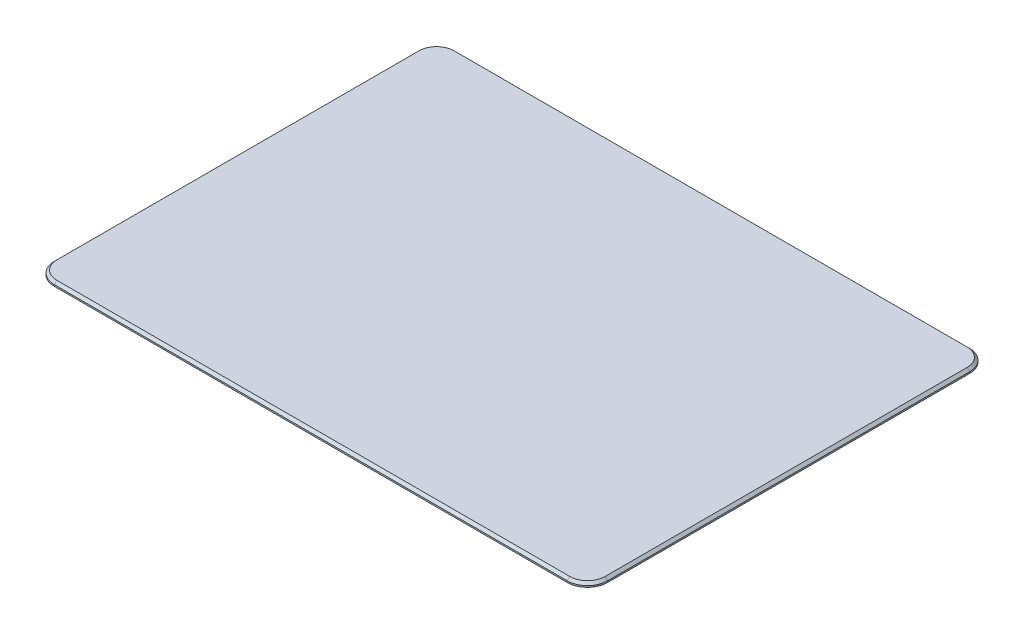
ISO-10303-21;
HEADER;
FILE_DESCRIPTION(('STEP AP214'),'2;1');
FILE_NAME('part.step','',(''),(''),'','','');
FILE_SCHEMA(('AUTOMOTIVE_DESIGN { 1 0 10303 214 1 1 1 1 }'));
ENDSEC;
DATA;
#1=APPLICATION_CONTEXT('core data for automotive mechanical design processes');
#2=APPLICATION_PROTOCOL_DEFINITION('international standard','automotive_design',2000,#1);
#3=PRODUCT_CONTEXT('',#1,'mechanical');
#4=PRODUCT('Part','Part','',(#3));
#5=PRODUCT_RELATED_PRODUCT_CATEGORY('part','',(#4));
#6=PRODUCT_DEFINITION_FORMATION('','',#4);
#7=PRODUCT_DEFINITION_CONTEXT('part definition',#1,'design');
#8=PRODUCT_DEFINITION('design','',#6,#7);
#9=PRODUCT_DEFINITION_SHAPE('','',#8);
#10=(LENGTH_UNIT() NAMED_UNIT(*) SI_UNIT(.MILLI.,.METRE.));
#11=(NAMED_UNIT(*) PLANE_ANGLE_UNIT() SI_UNIT($,.RADIAN.));
#12=(NAMED_UNIT(*) SI_UNIT($,.STERADIAN.) SOLID_ANGLE_UNIT());
#13=UNCERTAINTY_MEASURE_WITH_UNIT(LENGTH_MEASURE(1.E-05),#10,'distance_accuracy_value','');
#14=(GEOMETRIC_REPRESENTATION_CONTEXT(3) GLOBAL_UNCERTAINTY_ASSIGNED_CONTEXT((#13)) GLOBAL_UNIT_ASSIGNED_CONTEXT((#10,
#11,#12)) REPRESENTATION_CONTEXT('',''));
#15=CARTESIAN_POINT('',(0.,0.,0.));
#16=DIRECTION('',(0.,0.,1.));
#17=DIRECTION('',(1.,0.,0.));
#18=AXIS2_PLACEMENT_3D('',#15,#16,#17);
#19=CARTESIAN_POINT('',(275.,4.,200.));
#20=DIRECTION('',(-1.,0.,0.));
#21=DIRECTION('',(0.,0.,1.));
#22=AXIS2_PLACEMENT_3D('',#19,#20,#21);
#23=PLANE('',#22);
#24=DIRECTION('',(0.,-1.,0.));
#25=VECTOR('',#24,1.);
#26=CARTESIAN_POINT('',(275.,4.,-180.));
#27=LINE('',#26,#25);
#28=CARTESIAN_POINT('',(275.,0.,-180.));
#29=VERTEX_POINT('',#28);
#30=CARTESIAN_POINT('',(275.,1.49999999999989,-180.));
#31=VERTEX_POINT('',#30);
#32=EDGE_CURVE('E169',#29,#31,#27,.F.);
#33=ORIENTED_EDGE('',*,*,#32,.T.);
#34=DIRECTION('',(0.,0.,1.));
#35=VECTOR('',#34,1.);
#36=CARTESIAN_POINT('',(275.,1.49999999999989,200.));
#37=LINE('',#36,#35);
#38=CARTESIAN_POINT('',(275.,1.49999999999989,180.));
#39=VERTEX_POINT('',#38);
#40=EDGE_CURVE('E192',#31,#39,#37,.T.);
#41=ORIENTED_EDGE('',*,*,#40,.T.);
#42=DIRECTION('',(0.,-1.,0.));
#43=VECTOR('',#42,1.);
#44=CARTESIAN_POINT('',(275.,4.,180.));
#45=LINE('',#44,#43);
#46=CARTESIAN_POINT('',(275.,0.,180.));
#47=VERTEX_POINT('',#46);
#48=EDGE_CURVE('E167',#39,#47,#45,.T.);
#49=ORIENTED_EDGE('',*,*,#48,.T.);
#50=DIRECTION('',(0.,0.,-1.));
#51=VECTOR('',#50,1.);
#52=CARTESIAN_POINT('',(275.,0.,200.));
#53=LINE('',#52,#51);
#54=EDGE_CURVE('E151',#47,#29,#53,.T.);
#55=ORIENTED_EDGE('',*,*,#54,.T.);
#56=EDGE_LOOP('',(#33,#41,#49,#55));
#57=FACE_BOUND('',#56,.T.);
#58=ADVANCED_FACE('F35',(#57),#23,.F.);
#59=CARTESIAN_POINT('',(-275.,4.,-200.));
#60=DIRECTION('',(0.,0.,1.));
#61=DIRECTION('',(1.,0.,0.));
#62=AXIS2_PLACEMENT_3D('',#59,#60,#61);
#63=PLANE('',#62);
#64=DIRECTION('',(0.,-1.,0.));
#65=VECTOR('',#64,1.);
#66=CARTESIAN_POINT('',(-255.,4.,-200.));
#67=LINE('',#66,#65);
#68=CARTESIAN_POINT('',(-255.,0.,-200.));
#69=VERTEX_POINT('',#68);
#70=CARTESIAN_POINT('',(-255.,1.49999999999989,-200.));
#71=VERTEX_POINT('',#70);
#72=EDGE_CURVE('E136',#69,#71,#67,.F.);
#73=ORIENTED_EDGE('',*,*,#72,.T.);
#74=DIRECTION('',(1.,0.,0.));
#75=VECTOR('',#74,1.);
#76=CARTESIAN_POINT('',(-275.,1.49999999999989,-200.));
#77=LINE('',#76,#75);
#78=CARTESIAN_POINT('',(255.,1.49999999999989,-200.));
#79=VERTEX_POINT('',#78);
#80=EDGE_CURVE('E11',#71,#79,#77,.T.);
#81=ORIENTED_EDGE('',*,*,#80,.T.);
#82=DIRECTION('',(0.,-1.,0.));
#83=VECTOR('',#82,1.);
#84=CARTESIAN_POINT('',(255.,4.,-200.));
#85=LINE('',#84,#83);
#86=CARTESIAN_POINT('',(255.,0.,-200.));
#87=VERTEX_POINT('',#86);
#88=EDGE_CURVE('E140',#79,#87,#85,.T.);
#89=ORIENTED_EDGE('',*,*,#88,.T.);
#90=DIRECTION('',(-1.,0.,0.));
#91=VECTOR('',#90,1.);
#92=CARTESIAN_POINT('',(-275.,0.,-200.));
#93=LINE('',#92,#91);
#94=EDGE_CURVE('E147',#87,#69,#93,.T.);
#95=ORIENTED_EDGE('',*,*,#94,.T.);
#96=EDGE_LOOP('',(#73,#81,#89,#95));
#97=FACE_BOUND('',#96,.T.);
#98=ADVANCED_FACE('F285',(#97),#63,.F.);
#99=CARTESIAN_POINT('',(-275.,4.,200.));
#100=DIRECTION('',(1.,0.,0.));
#101=DIRECTION('',(0.,0.,-1.));
#102=AXIS2_PLACEMENT_3D('',#99,#100,#101);
#103=PLANE('',#102);
#104=DIRECTION('',(0.,-1.,0.));
#105=VECTOR('',#104,1.);
#106=CARTESIAN_POINT('',(-275.,4.,180.));
#107=LINE('',#106,#105);
#108=CARTESIAN_POINT('',(-275.,0.,180.));
#109=VERTEX_POINT('',#108);
#110=CARTESIAN_POINT('',(-275.,1.49999999999989,180.));
#111=VERTEX_POINT('',#110);
#112=EDGE_CURVE('E132',#109,#111,#107,.F.);
#113=ORIENTED_EDGE('',*,*,#112,.T.);
#114=DIRECTION('',(0.,0.,-1.));
#115=VECTOR('',#114,1.);
#116=CARTESIAN_POINT('',(-275.,1.49999999999989,200.));
#117=LINE('',#116,#115);
#118=CARTESIAN_POINT('',(-275.,1.49999999999989,-180.));
#119=VERTEX_POINT('',#118);
#120=EDGE_CURVE('E59',#111,#119,#117,.T.);
#121=ORIENTED_EDGE('',*,*,#120,.T.);
#122=DIRECTION('',(0.,-1.,0.));
#123=VECTOR('',#122,1.);
#124=CARTESIAN_POINT('',(-275.,4.,-180.));
#125=LINE('',#124,#123);
#126=CARTESIAN_POINT('',(-275.,0.,-180.));
#127=VERTEX_POINT('',#126);
#128=EDGE_CURVE('E124',#119,#127,#125,.T.);
#129=ORIENTED_EDGE('',*,*,#128,.T.);
#130=DIRECTION('',(0.,0.,1.));
#131=VECTOR('',#130,1.);
#132=CARTESIAN_POINT('',(-275.,0.,200.));
#133=LINE('',#132,#131);
#134=EDGE_CURVE('E128',#127,#109,#133,.T.);
#135=ORIENTED_EDGE('',*,*,#134,.T.);
#136=EDGE_LOOP('',(#113,#121,#129,#135));
#137=FACE_BOUND('',#136,.T.);
#138=ADVANCED_FACE('F126',(#137),#103,.F.);
#139=CARTESIAN_POINT('',(-275.,4.,200.));
#140=DIRECTION('',(0.,0.,-1.));
#141=DIRECTION('',(-1.,0.,0.));
#142=AXIS2_PLACEMENT_3D('',#139,#140,#141);
#143=PLANE('',#142);
#144=DIRECTION('',(0.,-1.,0.));
#145=VECTOR('',#144,1.);
#146=CARTESIAN_POINT('',(255.,4.,200.));
#147=LINE('',#146,#145);
#148=CARTESIAN_POINT('',(255.,0.,200.));
#149=VERTEX_POINT('',#148);
#150=CARTESIAN_POINT('',(255.,1.49999999999989,200.));
#151=VERTEX_POINT('',#150);
#152=EDGE_CURVE('E162',#149,#151,#147,.F.);
#153=ORIENTED_EDGE('',*,*,#152,.T.);
#154=DIRECTION('',(-1.,0.,0.));
#155=VECTOR('',#154,1.);
#156=CARTESIAN_POINT('',(-275.,1.49999999999989,200.));
#157=LINE('',#156,#155);
#158=CARTESIAN_POINT('',(-255.,1.49999999999989,200.));
#159=VERTEX_POINT('',#158);
#160=EDGE_CURVE('E196',#151,#159,#157,.T.);
#161=ORIENTED_EDGE('',*,*,#160,.T.);
#162=DIRECTION('',(0.,-1.,0.));
#163=VECTOR('',#162,1.);
#164=CARTESIAN_POINT('',(-255.,4.,200.));
#165=LINE('',#164,#163);
#166=CARTESIAN_POINT('',(-255.,0.,200.));
#167=VERTEX_POINT('',#166);
#168=EDGE_CURVE('E165',#159,#167,#165,.T.);
#169=ORIENTED_EDGE('',*,*,#168,.T.);
#170=DIRECTION('',(1.,0.,0.));
#171=VECTOR('',#170,1.);
#172=CARTESIAN_POINT('',(-275.,0.,200.));
#173=LINE('',#172,#171);
#174=EDGE_CURVE('E146',#167,#149,#173,.T.);
#175=ORIENTED_EDGE('',*,*,#174,.T.);
#176=EDGE_LOOP('',(#153,#161,#169,#175));
#177=FACE_BOUND('',#176,.T.);
#178=ADVANCED_FACE('F267',(#177),#143,.F.);
#179=CARTESIAN_POINT('',(0.,4.,0.));
#180=DIRECTION('',(0.,-1.,0.));
#181=DIRECTION('',(0.,0.,-1.));
#182=AXIS2_PLACEMENT_3D('',#179,#180,#181);
#183=PLANE('',#182);
#184=DIRECTION('',(0.,0.,-1.));
#185=VECTOR('',#184,1.);
#186=CARTESIAN_POINT('',(272.5,4.,0.));
#187=LINE('',#186,#185);
#188=CARTESIAN_POINT('',(272.5,4.,180.));
#189=VERTEX_POINT('',#188);
#190=CARTESIAN_POINT('',(272.5,4.,-180.));
#191=VERTEX_POINT('',#190);
#192=EDGE_CURVE('E184',#189,#191,#187,.T.);
#193=ORIENTED_EDGE('',*,*,#192,.T.);
#194=CARTESIAN_POINT('',(255.,4.,-180.));
#195=DIRECTION('',(0.,-1.,0.));
#196=DIRECTION('',(0.,0.,-1.));
#197=AXIS2_PLACEMENT_3D('',#194,#195,#196);
#198=CIRCLE('',#197,17.4999999999999);
#199=CARTESIAN_POINT('',(255.,4.,-197.5));
#200=VERTEX_POINT('',#199);
#201=EDGE_CURVE('E186',#191,#200,#198,.F.);
#202=ORIENTED_EDGE('',*,*,#201,.T.);
#203=DIRECTION('',(-1.,0.,0.));
#204=VECTOR('',#203,1.);
#205=CARTESIAN_POINT('',(0.,4.,-197.5));
#206=LINE('',#205,#204);
#207=CARTESIAN_POINT('',(-255.,4.,-197.5));
#208=VERTEX_POINT('',#207);
#209=EDGE_CURVE('E172',#200,#208,#206,.T.);
#210=ORIENTED_EDGE('',*,*,#209,.T.);
#211=CARTESIAN_POINT('',(-255.,4.,-180.));
#212=DIRECTION('',(0.,-1.,0.));
#213=DIRECTION('',(0.,0.,-1.));
#214=AXIS2_PLACEMENT_3D('',#211,#212,#213);
#215=CIRCLE('',#214,17.4999999999999);
#216=CARTESIAN_POINT('',(-272.5,4.,-180.));
#217=VERTEX_POINT('',#216);
#218=EDGE_CURVE('E174',#208,#217,#215,.F.);
#219=ORIENTED_EDGE('',*,*,#218,.T.);
#220=DIRECTION('',(0.,0.,1.));
#221=VECTOR('',#220,1.);
#222=CARTESIAN_POINT('',(-272.5,4.,0.));
#223=LINE('',#222,#221);
#224=CARTESIAN_POINT('',(-272.5,4.,180.));
#225=VERTEX_POINT('',#224);
#226=EDGE_CURVE('E176',#217,#225,#223,.T.);
#227=ORIENTED_EDGE('',*,*,#226,.T.);
#228=CARTESIAN_POINT('',(-255.,4.,180.));
#229=DIRECTION('',(0.,-1.,0.));
#230=DIRECTION('',(0.,0.,-1.));
#231=AXIS2_PLACEMENT_3D('',#228,#229,#230);
#232=CIRCLE('',#231,17.4999999999999);
#233=CARTESIAN_POINT('',(-255.,4.,197.5));
#234=VERTEX_POINT('',#233);
#235=EDGE_CURVE('E178',#225,#234,#232,.F.);
#236=ORIENTED_EDGE('',*,*,#235,.T.);
#237=DIRECTION('',(1.,0.,0.));
#238=VECTOR('',#237,1.);
#239=CARTESIAN_POINT('',(0.,4.,197.5));
#240=LINE('',#239,#238);
#241=CARTESIAN_POINT('',(255.,4.,197.5));
#242=VERTEX_POINT('',#241);
#243=EDGE_CURVE('E180',#234,#242,#240,.T.);
#244=ORIENTED_EDGE('',*,*,#243,.T.);
#245=CARTESIAN_POINT('',(255.,4.,180.));
#246=DIRECTION('',(0.,-1.,0.));
#247=DIRECTION('',(0.,0.,-1.));
#248=AXIS2_PLACEMENT_3D('',#245,#246,#247);
#249=CIRCLE('',#248,17.4999999999999);
#250=EDGE_CURVE('E182',#242,#189,#249,.F.);
#251=ORIENTED_EDGE('',*,*,#250,.T.);
#252=EDGE_LOOP('',(#193,#202,#210,#219,#227,#236,#244,#251));
#253=FACE_BOUND('',#252,.T.);
#254=ADVANCED_FACE('F251',(#253),#183,.F.);
#255=CARTESIAN_POINT('',(0.,0.,0.));
#256=DIRECTION('',(0.,-1.,0.));
#257=DIRECTION('',(0.,0.,-1.));
#258=AXIS2_PLACEMENT_3D('',#255,#256,#257);
#259=PLANE('',#258);
#260=ORIENTED_EDGE('',*,*,#134,.F.);
#261=CARTESIAN_POINT('',(-255.,0.,-180.));
#262=DIRECTION('',(0.,-1.,0.));
#263=DIRECTION('',(0.,0.,-1.));
#264=AXIS2_PLACEMENT_3D('',#261,#262,#263);
#265=CIRCLE('',#264,20.);
#266=EDGE_CURVE('E134',#127,#69,#265,.T.);
#267=ORIENTED_EDGE('',*,*,#266,.T.);
#268=ORIENTED_EDGE('',*,*,#94,.F.);
#269=CARTESIAN_POINT('',(255.,0.,-180.));
#270=DIRECTION('',(0.,-1.,0.));
#271=DIRECTION('',(0.,0.,-1.));
#272=AXIS2_PLACEMENT_3D('',#269,#270,#271);
#273=CIRCLE('',#272,20.);
#274=EDGE_CURVE('E157',#87,#29,#273,.T.);
#275=ORIENTED_EDGE('',*,*,#274,.T.);
#276=ORIENTED_EDGE('',*,*,#54,.F.);
#277=CARTESIAN_POINT('',(255.,0.,180.));
#278=DIRECTION('',(0.,-1.,0.));
#279=DIRECTION('',(0.,0.,-1.));
#280=AXIS2_PLACEMENT_3D('',#277,#278,#279);
#281=CIRCLE('',#280,20.);
#282=EDGE_CURVE('E131',#47,#149,#281,.T.);
#283=ORIENTED_EDGE('',*,*,#282,.T.);
#284=ORIENTED_EDGE('',*,*,#174,.F.);
#285=CARTESIAN_POINT('',(-255.,0.,180.));
#286=DIRECTION('',(0.,-1.,0.));
#287=DIRECTION('',(0.,0.,-1.));
#288=AXIS2_PLACEMENT_3D('',#285,#286,#287);
#289=CIRCLE('',#288,20.);
#290=EDGE_CURVE('E141',#167,#109,#289,.T.);
#291=ORIENTED_EDGE('',*,*,#290,.T.);
#292=EDGE_LOOP('',(#260,#267,#268,#275,#276,#283,#284,#291));
#293=FACE_BOUND('',#292,.T.);
#294=ADVANCED_FACE('F143',(#293),#259,.T.);
#295=CARTESIAN_POINT('',(-255.,4.,-180.));
#296=DIRECTION('',(0.,-1.,0.));
#297=DIRECTION('',(0.,0.,-1.));
#298=AXIS2_PLACEMENT_3D('',#295,#296,#297);
#299=CYLINDRICAL_SURFACE('',#298,20.);
#300=ORIENTED_EDGE('',*,*,#128,.F.);
#301=CARTESIAN_POINT('',(-255.,1.49999999999989,-180.));
#302=DIRECTION('',(0.,-1.,0.));
#303=DIRECTION('',(0.,0.,-1.));
#304=AXIS2_PLACEMENT_3D('',#301,#302,#303);
#305=CIRCLE('',#304,20.);
#306=EDGE_CURVE('E44',#119,#71,#305,.T.);
#307=ORIENTED_EDGE('',*,*,#306,.T.);
#308=ORIENTED_EDGE('',*,*,#72,.F.);
#309=ORIENTED_EDGE('',*,*,#266,.F.);
#310=EDGE_LOOP('',(#300,#307,#308,#309));
#311=FACE_BOUND('',#310,.T.);
#312=ADVANCED_FACE('F135',(#311),#299,.T.);
#313=CARTESIAN_POINT('',(-255.,4.,180.));
#314=DIRECTION('',(0.,-1.,0.));
#315=DIRECTION('',(0.,0.,-1.));
#316=AXIS2_PLACEMENT_3D('',#313,#314,#315);
#317=CYLINDRICAL_SURFACE('',#316,20.);
#318=ORIENTED_EDGE('',*,*,#168,.F.);
#319=CARTESIAN_POINT('',(-255.,1.49999999999989,180.));
#320=DIRECTION('',(0.,-1.,0.));
#321=DIRECTION('',(0.,0.,-1.));
#322=AXIS2_PLACEMENT_3D('',#319,#320,#321);
#323=CIRCLE('',#322,20.);
#324=EDGE_CURVE('E198',#159,#111,#323,.T.);
#325=ORIENTED_EDGE('',*,*,#324,.T.);
#326=ORIENTED_EDGE('',*,*,#112,.F.);
#327=ORIENTED_EDGE('',*,*,#290,.F.);
#328=EDGE_LOOP('',(#318,#325,#326,#327));
#329=FACE_BOUND('',#328,.T.);
#330=ADVANCED_FACE('F270',(#329),#317,.T.);
#331=CARTESIAN_POINT('',(255.,4.,-180.));
#332=DIRECTION('',(0.,-1.,0.));
#333=DIRECTION('',(0.,0.,-1.));
#334=AXIS2_PLACEMENT_3D('',#331,#332,#333);
#335=CYLINDRICAL_SURFACE('',#334,20.);
#336=ORIENTED_EDGE('',*,*,#88,.F.);
#337=CARTESIAN_POINT('',(255.,1.49999999999989,-180.));
#338=DIRECTION('',(0.,-1.,0.));
#339=DIRECTION('',(0.,0.,-1.));
#340=AXIS2_PLACEMENT_3D('',#337,#338,#339);
#341=CIRCLE('',#340,20.);
#342=EDGE_CURVE('E189',#79,#31,#341,.T.);
#343=ORIENTED_EDGE('',*,*,#342,.T.);
#344=ORIENTED_EDGE('',*,*,#32,.F.);
#345=ORIENTED_EDGE('',*,*,#274,.F.);
#346=EDGE_LOOP('',(#336,#343,#344,#345));
#347=FACE_BOUND('',#346,.T.);
#348=ADVANCED_FACE('F236',(#347),#335,.T.);
#349=CARTESIAN_POINT('',(255.,4.,180.));
#350=DIRECTION('',(0.,-1.,0.));
#351=DIRECTION('',(0.,0.,-1.));
#352=AXIS2_PLACEMENT_3D('',#349,#350,#351);
#353=CYLINDRICAL_SURFACE('',#352,20.);
#354=ORIENTED_EDGE('',*,*,#48,.F.);
#355=CARTESIAN_POINT('',(255.,1.49999999999989,180.));
#356=DIRECTION('',(0.,-1.,0.));
#357=DIRECTION('',(0.,0.,-1.));
#358=AXIS2_PLACEMENT_3D('',#355,#356,#357);
#359=CIRCLE('',#358,20.);
#360=EDGE_CURVE('E194',#39,#151,#359,.T.);
#361=ORIENTED_EDGE('',*,*,#360,.T.);
#362=ORIENTED_EDGE('',*,*,#152,.F.);
#363=ORIENTED_EDGE('',*,*,#282,.F.);
#364=EDGE_LOOP('',(#354,#361,#362,#363));
#365=FACE_BOUND('',#364,.T.);
#366=ADVANCED_FACE('F259',(#365),#353,.T.);
#367=CARTESIAN_POINT('',(-255.,4.,180.));
#368=DIRECTION('',(0.,-1.,0.));
#369=DIRECTION('',(0.,0.,-1.));
#370=AXIS2_PLACEMENT_3D('',#367,#368,#369);
#371=CONICAL_SURFACE('',#370,17.4999999999999,0.78539816339745);
#372=DIRECTION('',(0.707106781186548,0.707106781186548,0.));
#373=VECTOR('',#372,1.);
#374=CARTESIAN_POINT('',(-275.,1.49999999999989,180.));
#375=LINE('',#374,#373);
#376=EDGE_CURVE('E217',#111,#225,#375,.T.);
#377=ORIENTED_EDGE('',*,*,#376,.F.);
#378=ORIENTED_EDGE('',*,*,#324,.F.);
#379=DIRECTION('',(0.,-0.707106781186548,0.707106781186548));
#380=VECTOR('',#379,1.);
#381=CARTESIAN_POINT('',(-255.,4.,197.5));
#382=LINE('',#381,#380);
#383=EDGE_CURVE('E39',#234,#159,#382,.T.);
#384=ORIENTED_EDGE('',*,*,#383,.F.);
#385=ORIENTED_EDGE('',*,*,#235,.F.);
#386=EDGE_LOOP('',(#377,#378,#384,#385));
#387=FACE_BOUND('',#386,.T.);
#388=ADVANCED_FACE('F37',(#387),#371,.T.);
#389=CARTESIAN_POINT('',(0.,4.,197.5));
#390=DIRECTION('',(0.,-0.707106781186548,-0.707106781186548));
#391=DIRECTION('',(1.,0.,0.));
#392=AXIS2_PLACEMENT_3D('',#389,#390,#391);
#393=PLANE('',#392);
#394=ORIENTED_EDGE('',*,*,#383,.T.);
#395=ORIENTED_EDGE('',*,*,#160,.F.);
#396=DIRECTION('',(0.,-0.707106781186548,0.707106781186548));
#397=VECTOR('',#396,1.);
#398=CARTESIAN_POINT('',(255.,4.,197.5));
#399=LINE('',#398,#397);
#400=EDGE_CURVE('E215',#242,#151,#399,.T.);
#401=ORIENTED_EDGE('',*,*,#400,.F.);
#402=ORIENTED_EDGE('',*,*,#243,.F.);
#403=EDGE_LOOP('',(#394,#395,#401,#402));
#404=FACE_BOUND('',#403,.T.);
#405=ADVANCED_FACE('F264',(#404),#393,.F.);
#406=CARTESIAN_POINT('',(-272.5,4.,0.));
#407=DIRECTION('',(0.707106781186548,-0.707106781186548,0.));
#408=DIRECTION('',(0.,0.,1.));
#409=AXIS2_PLACEMENT_3D('',#406,#407,#408);
#410=PLANE('',#409);
#411=ORIENTED_EDGE('',*,*,#376,.T.);
#412=ORIENTED_EDGE('',*,*,#226,.F.);
#413=DIRECTION('',(0.707106781186548,0.707106781186548,0.));
#414=VECTOR('',#413,1.);
#415=CARTESIAN_POINT('',(-275.,1.49999999999989,-180.));
#416=LINE('',#415,#414);
#417=EDGE_CURVE('E212',#119,#217,#416,.T.);
#418=ORIENTED_EDGE('',*,*,#417,.F.);
#419=ORIENTED_EDGE('',*,*,#120,.F.);
#420=EDGE_LOOP('',(#411,#412,#418,#419));
#421=FACE_BOUND('',#420,.T.);
#422=ADVANCED_FACE('F273',(#421),#410,.F.);
#423=CARTESIAN_POINT('',(255.,4.,180.));
#424=DIRECTION('',(0.,-1.,0.));
#425=DIRECTION('',(0.,0.,-1.));
#426=AXIS2_PLACEMENT_3D('',#423,#424,#425);
#427=CONICAL_SURFACE('',#426,17.4999999999999,0.785398163397445);
#428=ORIENTED_EDGE('',*,*,#400,.T.);
#429=ORIENTED_EDGE('',*,*,#360,.F.);
#430=DIRECTION('',(0.707106781186548,-0.707106781186548,0.));
#431=VECTOR('',#430,1.);
#432=CARTESIAN_POINT('',(272.5,4.,180.));
#433=LINE('',#432,#431);
#434=EDGE_CURVE('E209',#189,#39,#433,.T.);
#435=ORIENTED_EDGE('',*,*,#434,.F.);
#436=ORIENTED_EDGE('',*,*,#250,.F.);
#437=EDGE_LOOP('',(#428,#429,#435,#436));
#438=FACE_BOUND('',#437,.T.);
#439=ADVANCED_FACE('F262',(#438),#427,.T.);
#440=CARTESIAN_POINT('',(-255.,4.,-180.));
#441=DIRECTION('',(0.,-1.,0.));
#442=DIRECTION('',(0.,0.,-1.));
#443=AXIS2_PLACEMENT_3D('',#440,#441,#442);
#444=CONICAL_SURFACE('',#443,17.4999999999999,0.785398163397445);
#445=ORIENTED_EDGE('',*,*,#417,.T.);
#446=ORIENTED_EDGE('',*,*,#218,.F.);
#447=DIRECTION('',(0.,0.707106781186551,0.707106781186544));
#448=VECTOR('',#447,1.);
#449=CARTESIAN_POINT('',(-255.,1.49999999999989,-200.));
#450=LINE('',#449,#448);
#451=EDGE_CURVE('E206',#71,#208,#450,.T.);
#452=ORIENTED_EDGE('',*,*,#451,.F.);
#453=ORIENTED_EDGE('',*,*,#306,.F.);
#454=EDGE_LOOP('',(#445,#446,#452,#453));
#455=FACE_BOUND('',#454,.T.);
#456=ADVANCED_FACE('F275',(#455),#444,.T.);
#457=CARTESIAN_POINT('',(272.5,4.,0.));
#458=DIRECTION('',(-0.707106781186548,-0.707106781186548,0.));
#459=DIRECTION('',(0.,0.,-1.));
#460=AXIS2_PLACEMENT_3D('',#457,#458,#459);
#461=PLANE('',#460);
#462=ORIENTED_EDGE('',*,*,#434,.T.);
#463=ORIENTED_EDGE('',*,*,#40,.F.);
#464=DIRECTION('',(0.707106781186548,-0.707106781186548,0.));
#465=VECTOR('',#464,1.);
#466=CARTESIAN_POINT('',(272.5,4.,-180.));
#467=LINE('',#466,#465);
#468=EDGE_CURVE('E204',#191,#31,#467,.T.);
#469=ORIENTED_EDGE('',*,*,#468,.F.);
#470=ORIENTED_EDGE('',*,*,#192,.F.);
#471=EDGE_LOOP('',(#462,#463,#469,#470));
#472=FACE_BOUND('',#471,.T.);
#473=ADVANCED_FACE('F256',(#472),#461,.F.);
#474=CARTESIAN_POINT('',(0.,4.,-197.5));
#475=DIRECTION('',(0.,-0.707106781186548,0.707106781186548));
#476=DIRECTION('',(-1.,0.,0.));
#477=AXIS2_PLACEMENT_3D('',#474,#475,#476);
#478=PLANE('',#477);
#479=ORIENTED_EDGE('',*,*,#451,.T.);
#480=ORIENTED_EDGE('',*,*,#209,.F.);
#481=DIRECTION('',(0.,0.707106781186548,0.707106781186548));
#482=VECTOR('',#481,1.);
#483=CARTESIAN_POINT('',(255.,1.49999999999989,-200.));
#484=LINE('',#483,#482);
#485=EDGE_CURVE('E202',#79,#200,#484,.T.);
#486=ORIENTED_EDGE('',*,*,#485,.F.);
#487=ORIENTED_EDGE('',*,*,#80,.F.);
#488=EDGE_LOOP('',(#479,#480,#486,#487));
#489=FACE_BOUND('',#488,.T.);
#490=ADVANCED_FACE('F247',(#489),#478,.F.);
#491=CARTESIAN_POINT('',(255.,4.,-180.));
#492=DIRECTION('',(0.,-1.,0.));
#493=DIRECTION('',(0.,0.,-1.));
#494=AXIS2_PLACEMENT_3D('',#491,#492,#493);
#495=CONICAL_SURFACE('',#494,17.4999999999999,0.78539816339745);
#496=ORIENTED_EDGE('',*,*,#468,.T.);
#497=ORIENTED_EDGE('',*,*,#342,.F.);
#498=ORIENTED_EDGE('',*,*,#485,.T.);
#499=ORIENTED_EDGE('',*,*,#201,.F.);
#500=EDGE_LOOP('',(#496,#497,#498,#499));
#501=FACE_BOUND('',#500,.T.);
#502=ADVANCED_FACE('F240',(#501),#495,.T.);
#503=CLOSED_SHELL('',(#58,#98,#138,#178,#254,#294,#312,#330,#348,#366,#388,#405,#422,#439,#456,
#473,#490,#502));
#504=MANIFOLD_SOLID_BREP('B2',#503);
#505=ADVANCED_BREP_SHAPE_REPRESENTATION('',(#18,#504),#14);
#506=SHAPE_DEFINITION_REPRESENTATION(#9,#505);
ENDSEC;
END-ISO-10303-21;
